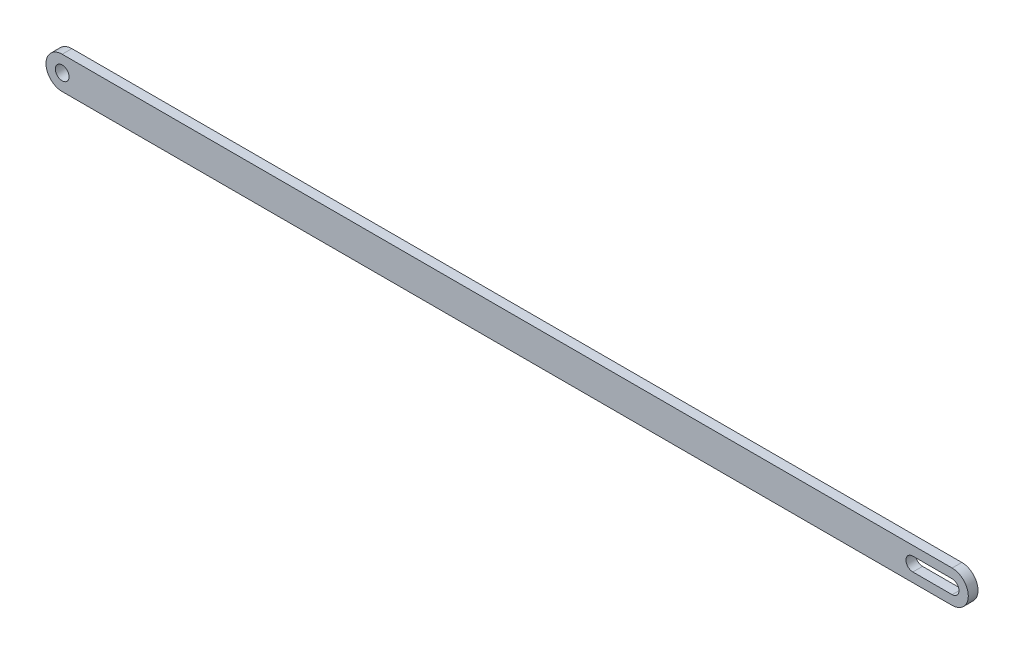
ISO-10303-21;
HEADER;
FILE_DESCRIPTION(('STEP AP214'),'2;1');
FILE_NAME('part.step','',(''),(''),'','','');
FILE_SCHEMA(('AUTOMOTIVE_DESIGN { 1 0 10303 214 1 1 1 1 }'));
ENDSEC;
DATA;
#1=APPLICATION_CONTEXT('core data for automotive mechanical design processes');
#2=APPLICATION_PROTOCOL_DEFINITION('international standard','automotive_design',2000,#1);
#3=PRODUCT_CONTEXT('',#1,'mechanical');
#4=PRODUCT('Part','Part','',(#3));
#5=PRODUCT_RELATED_PRODUCT_CATEGORY('part','',(#4));
#6=PRODUCT_DEFINITION_FORMATION('','',#4);
#7=PRODUCT_DEFINITION_CONTEXT('part definition',#1,'design');
#8=PRODUCT_DEFINITION('design','',#6,#7);
#9=PRODUCT_DEFINITION_SHAPE('','',#8);
#10=(LENGTH_UNIT() NAMED_UNIT(*) SI_UNIT(.MILLI.,.METRE.));
#11=(NAMED_UNIT(*) PLANE_ANGLE_UNIT() SI_UNIT($,.RADIAN.));
#12=(NAMED_UNIT(*) SI_UNIT($,.STERADIAN.) SOLID_ANGLE_UNIT());
#13=UNCERTAINTY_MEASURE_WITH_UNIT(LENGTH_MEASURE(1.E-05),#10,'distance_accuracy_value','');
#14=(GEOMETRIC_REPRESENTATION_CONTEXT(3) GLOBAL_UNCERTAINTY_ASSIGNED_CONTEXT((#13)) GLOBAL_UNIT_ASSIGNED_CONTEXT((#10,
#11,#12)) REPRESENTATION_CONTEXT('',''));
#15=CARTESIAN_POINT('',(0.,0.,0.));
#16=DIRECTION('',(0.,0.,1.));
#17=DIRECTION('',(1.,0.,0.));
#18=AXIS2_PLACEMENT_3D('',#15,#16,#17);
#19=CARTESIAN_POINT('',(0.,-4.,2.4));
#20=DIRECTION('',(0.,1.,0.));
#21=DIRECTION('',(0.,0.,1.));
#22=AXIS2_PLACEMENT_3D('',#19,#20,#21);
#23=PLANE('',#22);
#24=DIRECTION('',(1.,0.,0.));
#25=VECTOR('',#24,1.);
#26=CARTESIAN_POINT('',(0.,-4.,0.));
#27=LINE('',#26,#25);
#28=CARTESIAN_POINT('',(-53.8502428277937,-4.,0.));
#29=VERTEX_POINT('',#28);
#30=CARTESIAN_POINT('',(166.149757172206,-4.,0.));
#31=VERTEX_POINT('',#30);
#32=EDGE_CURVE('E148',#29,#31,#27,.T.);
#33=ORIENTED_EDGE('',*,*,#32,.T.);
#34=DIRECTION('',(0.,0.,-1.));
#35=VECTOR('',#34,1.);
#36=CARTESIAN_POINT('',(166.149757172206,-4.,2.4));
#37=LINE('',#36,#35);
#38=CARTESIAN_POINT('',(166.149757172206,-4.,2.4));
#39=VERTEX_POINT('',#38);
#40=EDGE_CURVE('E11',#39,#31,#37,.T.);
#41=ORIENTED_EDGE('',*,*,#40,.F.);
#42=DIRECTION('',(1.,0.,0.));
#43=VECTOR('',#42,1.);
#44=CARTESIAN_POINT('',(0.,-4.,2.4));
#45=LINE('',#44,#43);
#46=CARTESIAN_POINT('',(-53.8502428277937,-4.,2.4));
#47=VERTEX_POINT('',#46);
#48=EDGE_CURVE('E116',#47,#39,#45,.T.);
#49=ORIENTED_EDGE('',*,*,#48,.F.);
#50=DIRECTION('',(0.,0.,-1.));
#51=VECTOR('',#50,1.);
#52=CARTESIAN_POINT('',(-53.8502428277937,-4.,2.4));
#53=LINE('',#52,#51);
#54=EDGE_CURVE('E156',#47,#29,#53,.T.);
#55=ORIENTED_EDGE('',*,*,#54,.T.);
#56=EDGE_LOOP('',(#33,#41,#49,#55));
#57=FACE_BOUND('',#56,.T.);
#58=ADVANCED_FACE('F39',(#57),#23,.F.);
#59=CARTESIAN_POINT('',(166.149757172206,0.,2.4));
#60=DIRECTION('',(0.,0.,-1.));
#61=DIRECTION('',(-1.,0.,0.));
#62=AXIS2_PLACEMENT_3D('',#59,#60,#61);
#63=CYLINDRICAL_SURFACE('',#62,4.);
#64=CARTESIAN_POINT('',(166.149757172206,0.,0.));
#65=DIRECTION('',(0.,0.,1.));
#66=DIRECTION('',(1.,0.,0.));
#67=AXIS2_PLACEMENT_3D('',#64,#65,#66);
#68=CIRCLE('',#67,4.);
#69=CARTESIAN_POINT('',(166.149757172206,4.,0.));
#70=VERTEX_POINT('',#69);
#71=EDGE_CURVE('E122',#31,#70,#68,.T.);
#72=ORIENTED_EDGE('',*,*,#71,.T.);
#73=DIRECTION('',(0.,0.,-1.));
#74=VECTOR('',#73,1.);
#75=CARTESIAN_POINT('',(166.149757172206,4.,2.4));
#76=LINE('',#75,#74);
#77=CARTESIAN_POINT('',(166.149757172206,4.,2.4));
#78=VERTEX_POINT('',#77);
#79=EDGE_CURVE('E49',#78,#70,#76,.T.);
#80=ORIENTED_EDGE('',*,*,#79,.F.);
#81=CARTESIAN_POINT('',(166.149757172206,0.,2.4));
#82=DIRECTION('',(0.,0.,1.));
#83=DIRECTION('',(1.,0.,0.));
#84=AXIS2_PLACEMENT_3D('',#81,#82,#83);
#85=CIRCLE('',#84,4.);
#86=EDGE_CURVE('E110',#39,#78,#85,.T.);
#87=ORIENTED_EDGE('',*,*,#86,.F.);
#88=ORIENTED_EDGE('',*,*,#40,.T.);
#89=EDGE_LOOP('',(#72,#80,#87,#88));
#90=FACE_BOUND('',#89,.T.);
#91=ADVANCED_FACE('F121',(#90),#63,.T.);
#92=CARTESIAN_POINT('',(0.,4.,2.4));
#93=DIRECTION('',(0.,1.,0.));
#94=DIRECTION('',(0.,0.,1.));
#95=AXIS2_PLACEMENT_3D('',#92,#93,#94);
#96=PLANE('',#95);
#97=DIRECTION('',(1.,0.,0.));
#98=VECTOR('',#97,1.);
#99=CARTESIAN_POINT('',(0.,4.,0.));
#100=LINE('',#99,#98);
#101=CARTESIAN_POINT('',(-53.8502428277937,4.,0.));
#102=VERTEX_POINT('',#101);
#103=EDGE_CURVE('E152',#102,#70,#100,.T.);
#104=ORIENTED_EDGE('',*,*,#103,.F.);
#105=DIRECTION('',(0.,0.,-1.));
#106=VECTOR('',#105,1.);
#107=CARTESIAN_POINT('',(-53.8502428277937,4.,2.4));
#108=LINE('',#107,#106);
#109=CARTESIAN_POINT('',(-53.8502428277937,4.,2.4));
#110=VERTEX_POINT('',#109);
#111=EDGE_CURVE('E86',#110,#102,#108,.T.);
#112=ORIENTED_EDGE('',*,*,#111,.F.);
#113=DIRECTION('',(1.,0.,0.));
#114=VECTOR('',#113,1.);
#115=CARTESIAN_POINT('',(0.,4.,2.4));
#116=LINE('',#115,#114);
#117=EDGE_CURVE('E114',#110,#78,#116,.T.);
#118=ORIENTED_EDGE('',*,*,#117,.T.);
#119=ORIENTED_EDGE('',*,*,#79,.T.);
#120=EDGE_LOOP('',(#104,#112,#118,#119));
#121=FACE_BOUND('',#120,.T.);
#122=ADVANCED_FACE('F127',(#121),#96,.T.);
#123=CARTESIAN_POINT('',(156.438691487467,0.,2.4));
#124=DIRECTION('',(0.,0.,-1.));
#125=DIRECTION('',(-1.,0.,0.));
#126=AXIS2_PLACEMENT_3D('',#123,#124,#125);
#127=CYLINDRICAL_SURFACE('',#126,1.70000000000001);
#128=CARTESIAN_POINT('',(156.438691487467,0.,0.));
#129=DIRECTION('',(0.,0.,1.));
#130=DIRECTION('',(1.,0.,0.));
#131=AXIS2_PLACEMENT_3D('',#128,#129,#130);
#132=CIRCLE('',#131,1.70000000000001);
#133=CARTESIAN_POINT('',(156.438691487467,1.70000000000001,0.));
#134=VERTEX_POINT('',#133);
#135=CARTESIAN_POINT('',(156.438691487467,-1.70000000000001,0.));
#136=VERTEX_POINT('',#135);
#137=EDGE_CURVE('E133',#134,#136,#132,.T.);
#138=ORIENTED_EDGE('',*,*,#137,.F.);
#139=DIRECTION('',(0.,0.,-1.));
#140=VECTOR('',#139,1.);
#141=CARTESIAN_POINT('',(156.438691487467,1.70000000000001,2.4));
#142=LINE('',#141,#140);
#143=CARTESIAN_POINT('',(156.438691487467,1.70000000000001,2.4));
#144=VERTEX_POINT('',#143);
#145=EDGE_CURVE('E43',#144,#134,#142,.T.);
#146=ORIENTED_EDGE('',*,*,#145,.F.);
#147=CARTESIAN_POINT('',(156.438691487467,0.,2.4));
#148=DIRECTION('',(0.,0.,1.));
#149=DIRECTION('',(1.,0.,0.));
#150=AXIS2_PLACEMENT_3D('',#147,#148,#149);
#151=CIRCLE('',#150,1.70000000000001);
#152=CARTESIAN_POINT('',(156.438691487467,-1.70000000000001,2.4));
#153=VERTEX_POINT('',#152);
#154=EDGE_CURVE('E155',#144,#153,#151,.T.);
#155=ORIENTED_EDGE('',*,*,#154,.T.);
#156=DIRECTION('',(0.,0.,-1.));
#157=VECTOR('',#156,1.);
#158=CARTESIAN_POINT('',(156.438691487467,-1.70000000000001,2.4));
#159=LINE('',#158,#157);
#160=EDGE_CURVE('E129',#153,#136,#159,.T.);
#161=ORIENTED_EDGE('',*,*,#160,.T.);
#162=EDGE_LOOP('',(#138,#146,#155,#161));
#163=FACE_BOUND('',#162,.T.);
#164=ADVANCED_FACE('F41',(#163),#127,.F.);
#165=CARTESIAN_POINT('',(0.,1.70000000000001,2.4));
#166=DIRECTION('',(0.,-1.,0.));
#167=DIRECTION('',(0.,0.,-1.));
#168=AXIS2_PLACEMENT_3D('',#165,#166,#167);
#169=PLANE('',#168);
#170=DIRECTION('',(-1.,0.,0.));
#171=VECTOR('',#170,1.);
#172=CARTESIAN_POINT('',(0.,1.70000000000001,0.));
#173=LINE('',#172,#171);
#174=CARTESIAN_POINT('',(166.149757172206,1.70000000000001,0.));
#175=VERTEX_POINT('',#174);
#176=EDGE_CURVE('E136',#175,#134,#173,.T.);
#177=ORIENTED_EDGE('',*,*,#176,.F.);
#178=DIRECTION('',(0.,0.,-1.));
#179=VECTOR('',#178,1.);
#180=CARTESIAN_POINT('',(166.149757172206,1.70000000000001,2.4));
#181=LINE('',#180,#179);
#182=CARTESIAN_POINT('',(166.149757172206,1.70000000000001,2.4));
#183=VERTEX_POINT('',#182);
#184=EDGE_CURVE('E161',#183,#175,#181,.T.);
#185=ORIENTED_EDGE('',*,*,#184,.F.);
#186=DIRECTION('',(-1.,0.,0.));
#187=VECTOR('',#186,1.);
#188=CARTESIAN_POINT('',(0.,1.70000000000001,2.4));
#189=LINE('',#188,#187);
#190=EDGE_CURVE('E170',#183,#144,#189,.T.);
#191=ORIENTED_EDGE('',*,*,#190,.T.);
#192=ORIENTED_EDGE('',*,*,#145,.T.);
#193=EDGE_LOOP('',(#177,#185,#191,#192));
#194=FACE_BOUND('',#193,.T.);
#195=ADVANCED_FACE('F168',(#194),#169,.T.);
#196=CARTESIAN_POINT('',(166.149757172206,0.,2.4));
#197=DIRECTION('',(0.,0.,-1.));
#198=DIRECTION('',(-1.,0.,0.));
#199=AXIS2_PLACEMENT_3D('',#196,#197,#198);
#200=CYLINDRICAL_SURFACE('',#199,1.70000000000001);
#201=CARTESIAN_POINT('',(166.149757172206,0.,0.));
#202=DIRECTION('',(0.,0.,1.));
#203=DIRECTION('',(1.,0.,0.));
#204=AXIS2_PLACEMENT_3D('',#201,#202,#203);
#205=CIRCLE('',#204,1.70000000000001);
#206=CARTESIAN_POINT('',(166.149757172206,-1.70000000000001,0.));
#207=VERTEX_POINT('',#206);
#208=EDGE_CURVE('E139',#207,#175,#205,.T.);
#209=ORIENTED_EDGE('',*,*,#208,.F.);
#210=DIRECTION('',(0.,0.,-1.));
#211=VECTOR('',#210,1.);
#212=CARTESIAN_POINT('',(166.149757172206,-1.70000000000001,2.4));
#213=LINE('',#212,#211);
#214=CARTESIAN_POINT('',(166.149757172206,-1.70000000000001,2.4));
#215=VERTEX_POINT('',#214);
#216=EDGE_CURVE('E160',#215,#207,#213,.T.);
#217=ORIENTED_EDGE('',*,*,#216,.F.);
#218=CARTESIAN_POINT('',(166.149757172206,0.,2.4));
#219=DIRECTION('',(0.,0.,1.));
#220=DIRECTION('',(1.,0.,0.));
#221=AXIS2_PLACEMENT_3D('',#218,#219,#220);
#222=CIRCLE('',#221,1.70000000000001);
#223=EDGE_CURVE('E177',#215,#183,#222,.T.);
#224=ORIENTED_EDGE('',*,*,#223,.T.);
#225=ORIENTED_EDGE('',*,*,#184,.T.);
#226=EDGE_LOOP('',(#209,#217,#224,#225));
#227=FACE_BOUND('',#226,.T.);
#228=ADVANCED_FACE('F175',(#227),#200,.F.);
#229=CARTESIAN_POINT('',(-53.8502428277937,0.,2.4));
#230=DIRECTION('',(0.,0.,-1.));
#231=DIRECTION('',(-1.,0.,0.));
#232=AXIS2_PLACEMENT_3D('',#229,#230,#231);
#233=CYLINDRICAL_SURFACE('',#232,1.7);
#234=CARTESIAN_POINT('',(-53.8502428277937,0.,2.4));
#235=DIRECTION('',(0.,0.,1.));
#236=DIRECTION('',(1.,0.,0.));
#237=AXIS2_PLACEMENT_3D('',#234,#235,#236);
#238=CIRCLE('',#237,1.7);
#239=CARTESIAN_POINT('',(-52.1502428277937,0.,2.4));
#240=VERTEX_POINT('',#239);
#241=EDGE_CURVE('E186',#240,#240,#238,.T.);
#242=ORIENTED_EDGE('',*,*,#241,.T.);
#243=EDGE_LOOP('',(#242));
#244=FACE_BOUND('',#243,.T.);
#245=CARTESIAN_POINT('',(-53.8502428277937,0.,0.));
#246=DIRECTION('',(0.,0.,1.));
#247=DIRECTION('',(1.,0.,0.));
#248=AXIS2_PLACEMENT_3D('',#245,#246,#247);
#249=CIRCLE('',#248,1.7);
#250=CARTESIAN_POINT('',(-52.1502428277937,0.,0.));
#251=VERTEX_POINT('',#250);
#252=EDGE_CURVE('E145',#251,#251,#249,.T.);
#253=ORIENTED_EDGE('',*,*,#252,.F.);
#254=EDGE_LOOP('',(#253));
#255=FACE_BOUND('',#254,.T.);
#256=ADVANCED_FACE('F194',(#244,#255),#233,.F.);
#257=CARTESIAN_POINT('',(0.,-1.70000000000001,2.4));
#258=DIRECTION('',(0.,1.,0.));
#259=DIRECTION('',(0.,0.,1.));
#260=AXIS2_PLACEMENT_3D('',#257,#258,#259);
#261=PLANE('',#260);
#262=DIRECTION('',(1.,0.,0.));
#263=VECTOR('',#262,1.);
#264=CARTESIAN_POINT('',(0.,-1.70000000000001,0.));
#265=LINE('',#264,#263);
#266=EDGE_CURVE('E142',#136,#207,#265,.T.);
#267=ORIENTED_EDGE('',*,*,#266,.F.);
#268=ORIENTED_EDGE('',*,*,#160,.F.);
#269=DIRECTION('',(1.,0.,0.));
#270=VECTOR('',#269,1.);
#271=CARTESIAN_POINT('',(0.,-1.70000000000001,2.4));
#272=LINE('',#271,#270);
#273=EDGE_CURVE('E183',#153,#215,#272,.T.);
#274=ORIENTED_EDGE('',*,*,#273,.T.);
#275=ORIENTED_EDGE('',*,*,#216,.T.);
#276=EDGE_LOOP('',(#267,#268,#274,#275));
#277=FACE_BOUND('',#276,.T.);
#278=ADVANCED_FACE('F185',(#277),#261,.T.);
#279=CARTESIAN_POINT('',(-53.8502428277937,0.,2.4));
#280=DIRECTION('',(0.,0.,-1.));
#281=DIRECTION('',(-1.,0.,0.));
#282=AXIS2_PLACEMENT_3D('',#279,#280,#281);
#283=CYLINDRICAL_SURFACE('',#282,4.);
#284=CARTESIAN_POINT('',(-53.8502428277937,0.,0.));
#285=DIRECTION('',(0.,0.,1.));
#286=DIRECTION('',(1.,0.,0.));
#287=AXIS2_PLACEMENT_3D('',#284,#285,#286);
#288=CIRCLE('',#287,4.);
#289=EDGE_CURVE('E89',#102,#29,#288,.T.);
#290=ORIENTED_EDGE('',*,*,#289,.T.);
#291=ORIENTED_EDGE('',*,*,#54,.F.);
#292=CARTESIAN_POINT('',(-53.8502428277937,0.,2.4));
#293=DIRECTION('',(0.,0.,1.));
#294=DIRECTION('',(1.,0.,0.));
#295=AXIS2_PLACEMENT_3D('',#292,#293,#294);
#296=CIRCLE('',#295,4.);
#297=EDGE_CURVE('E58',#110,#47,#296,.T.);
#298=ORIENTED_EDGE('',*,*,#297,.F.);
#299=ORIENTED_EDGE('',*,*,#111,.T.);
#300=EDGE_LOOP('',(#290,#291,#298,#299));
#301=FACE_BOUND('',#300,.T.);
#302=ADVANCED_FACE('F197',(#301),#283,.T.);
#303=CARTESIAN_POINT('',(0.,0.,2.4));
#304=DIRECTION('',(0.,0.,1.));
#305=DIRECTION('',(1.,0.,0.));
#306=AXIS2_PLACEMENT_3D('',#303,#304,#305);
#307=PLANE('',#306);
#308=ORIENTED_EDGE('',*,*,#154,.F.);
#309=ORIENTED_EDGE('',*,*,#190,.F.);
#310=ORIENTED_EDGE('',*,*,#223,.F.);
#311=ORIENTED_EDGE('',*,*,#273,.F.);
#312=EDGE_LOOP('',(#308,#309,#310,#311));
#313=FACE_BOUND('',#312,.T.);
#314=ORIENTED_EDGE('',*,*,#241,.F.);
#315=EDGE_LOOP('',(#314));
#316=FACE_BOUND('',#315,.T.);
#317=ORIENTED_EDGE('',*,*,#48,.T.);
#318=ORIENTED_EDGE('',*,*,#86,.T.);
#319=ORIENTED_EDGE('',*,*,#117,.F.);
#320=ORIENTED_EDGE('',*,*,#297,.T.);
#321=EDGE_LOOP('',(#317,#318,#319,#320));
#322=FACE_BOUND('',#321,.T.);
#323=ADVANCED_FACE('F112',(#313,#316,#322),#307,.T.);
#324=CARTESIAN_POINT('',(0.,0.,0.));
#325=DIRECTION('',(0.,0.,1.));
#326=DIRECTION('',(1.,0.,0.));
#327=AXIS2_PLACEMENT_3D('',#324,#325,#326);
#328=PLANE('',#327);
#329=ORIENTED_EDGE('',*,*,#137,.T.);
#330=ORIENTED_EDGE('',*,*,#266,.T.);
#331=ORIENTED_EDGE('',*,*,#208,.T.);
#332=ORIENTED_EDGE('',*,*,#176,.T.);
#333=EDGE_LOOP('',(#329,#330,#331,#332));
#334=FACE_BOUND('',#333,.T.);
#335=ORIENTED_EDGE('',*,*,#252,.T.);
#336=EDGE_LOOP('',(#335));
#337=FACE_BOUND('',#336,.T.);
#338=ORIENTED_EDGE('',*,*,#32,.F.);
#339=ORIENTED_EDGE('',*,*,#289,.F.);
#340=ORIENTED_EDGE('',*,*,#103,.T.);
#341=ORIENTED_EDGE('',*,*,#71,.F.);
#342=EDGE_LOOP('',(#338,#339,#340,#341));
#343=FACE_BOUND('',#342,.T.);
#344=ADVANCED_FACE('F173',(#334,#337,#343),#328,.F.);
#345=CLOSED_SHELL('',(#58,#91,#122,#164,#195,#228,#256,#278,#302,#323,#344));
#346=MANIFOLD_SOLID_BREP('B2',#345);
#347=ADVANCED_BREP_SHAPE_REPRESENTATION('',(#18,#346),#14);
#348=SHAPE_DEFINITION_REPRESENTATION(#9,#347);
ENDSEC;
END-ISO-10303-21;
